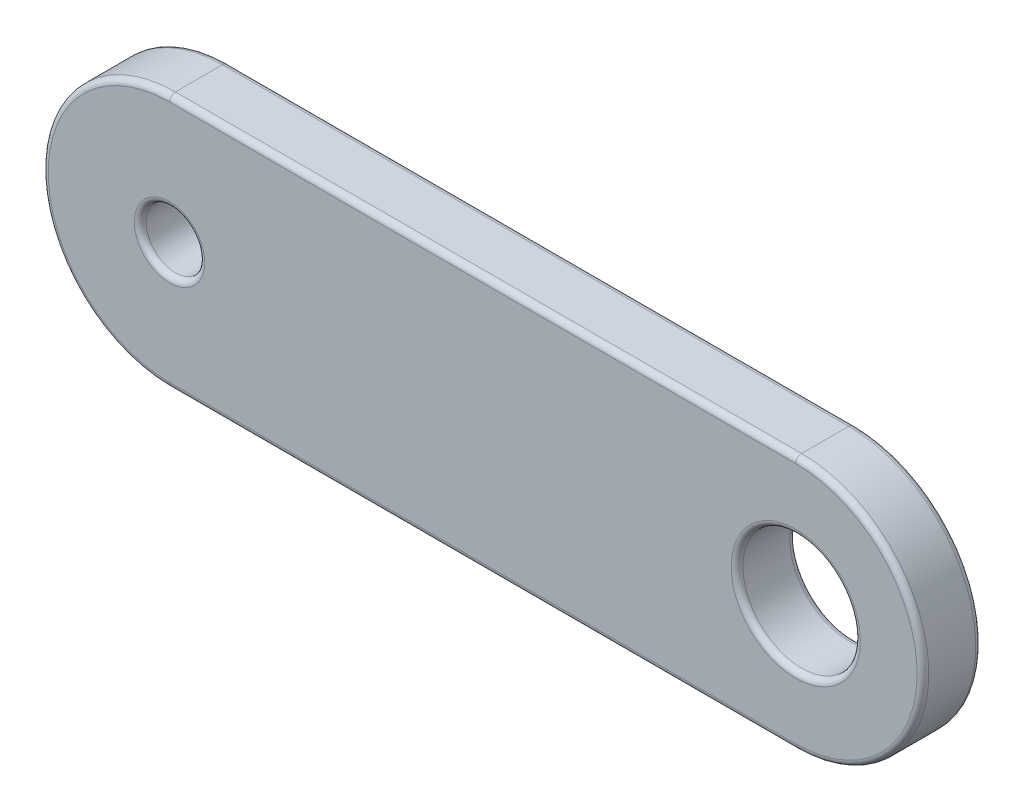
ISO-10303-21;
HEADER;
FILE_DESCRIPTION(('STEP AP214'),'2;1');
FILE_NAME('part.step','',(''),(''),'','','');
FILE_SCHEMA(('AUTOMOTIVE_DESIGN { 1 0 10303 214 1 1 1 1 }'));
ENDSEC;
DATA;
#1=APPLICATION_CONTEXT('core data for automotive mechanical design processes');
#2=APPLICATION_PROTOCOL_DEFINITION('international standard','automotive_design',2000,#1);
#3=PRODUCT_CONTEXT('',#1,'mechanical');
#4=PRODUCT('Part','Part','',(#3));
#5=PRODUCT_RELATED_PRODUCT_CATEGORY('part','',(#4));
#6=PRODUCT_DEFINITION_FORMATION('','',#4);
#7=PRODUCT_DEFINITION_CONTEXT('part definition',#1,'design');
#8=PRODUCT_DEFINITION('design','',#6,#7);
#9=PRODUCT_DEFINITION_SHAPE('','',#8);
#10=(LENGTH_UNIT() NAMED_UNIT(*) SI_UNIT(.MILLI.,.METRE.));
#11=(NAMED_UNIT(*) PLANE_ANGLE_UNIT() SI_UNIT($,.RADIAN.));
#12=(NAMED_UNIT(*) SI_UNIT($,.STERADIAN.) SOLID_ANGLE_UNIT());
#13=UNCERTAINTY_MEASURE_WITH_UNIT(LENGTH_MEASURE(1.E-05),#10,'distance_accuracy_value','');
#14=(GEOMETRIC_REPRESENTATION_CONTEXT(3) GLOBAL_UNCERTAINTY_ASSIGNED_CONTEXT((#13)) GLOBAL_UNIT_ASSIGNED_CONTEXT((#10,
#11,#12)) REPRESENTATION_CONTEXT('',''));
#15=CARTESIAN_POINT('',(0.,0.,0.));
#16=DIRECTION('',(0.,0.,1.));
#17=DIRECTION('',(1.,0.,0.));
#18=AXIS2_PLACEMENT_3D('',#15,#16,#17);
#19=CARTESIAN_POINT('',(-8.,0.,0.75));
#20=DIRECTION('',(0.,0.,1.));
#21=DIRECTION('',(1.,0.,0.));
#22=AXIS2_PLACEMENT_3D('',#19,#20,#21);
#23=PLANE('',#22);
#24=CARTESIAN_POINT('',(8.,0.,0.75));
#25=DIRECTION('',(0.,0.,1.));
#26=DIRECTION('',(1.,0.,0.));
#27=AXIS2_PLACEMENT_3D('',#24,#25,#26);
#28=CIRCLE('',#27,1.65);
#29=CARTESIAN_POINT('',(9.65,0.,0.75));
#30=VERTEX_POINT('',#29);
#31=EDGE_CURVE('E11',#30,#30,#28,.F.);
#32=ORIENTED_EDGE('',*,*,#31,.T.);
#33=EDGE_LOOP('',(#32));
#34=FACE_BOUND('',#33,.T.);
#35=CARTESIAN_POINT('',(8.,0.,0.75));
#36=DIRECTION('',(0.,0.,1.));
#37=DIRECTION('',(1.,0.,0.));
#38=AXIS2_PLACEMENT_3D('',#35,#36,#37);
#39=CIRCLE('',#38,3.1);
#40=CARTESIAN_POINT('',(8.,-3.1,0.75));
#41=VERTEX_POINT('',#40);
#42=CARTESIAN_POINT('',(8.,3.1,0.75));
#43=VERTEX_POINT('',#42);
#44=EDGE_CURVE('E52',#41,#43,#39,.T.);
#45=ORIENTED_EDGE('',*,*,#44,.T.);
#46=DIRECTION('',(-1.,0.,0.));
#47=VECTOR('',#46,1.);
#48=CARTESIAN_POINT('',(-8.,3.1,0.75));
#49=LINE('',#48,#47);
#50=CARTESIAN_POINT('',(-8.,3.1,0.75));
#51=VERTEX_POINT('',#50);
#52=EDGE_CURVE('E44',#43,#51,#49,.T.);
#53=ORIENTED_EDGE('',*,*,#52,.T.);
#54=CARTESIAN_POINT('',(-8.,0.,0.75));
#55=DIRECTION('',(0.,0.,1.));
#56=DIRECTION('',(1.,0.,0.));
#57=AXIS2_PLACEMENT_3D('',#54,#55,#56);
#58=CIRCLE('',#57,3.1);
#59=CARTESIAN_POINT('',(-8.,-3.1,0.75));
#60=VERTEX_POINT('',#59);
#61=EDGE_CURVE('E170',#51,#60,#58,.T.);
#62=ORIENTED_EDGE('',*,*,#61,.T.);
#63=DIRECTION('',(1.,0.,0.));
#64=VECTOR('',#63,1.);
#65=CARTESIAN_POINT('',(8.,-3.1,0.75));
#66=LINE('',#65,#64);
#67=EDGE_CURVE('E57',#60,#41,#66,.T.);
#68=ORIENTED_EDGE('',*,*,#67,.T.);
#69=EDGE_LOOP('',(#45,#53,#62,#68));
#70=FACE_BOUND('',#69,.T.);
#71=CARTESIAN_POINT('',(-8.,0.,0.75));
#72=DIRECTION('',(0.,0.,1.));
#73=DIRECTION('',(1.,0.,0.));
#74=AXIS2_PLACEMENT_3D('',#71,#72,#73);
#75=CIRCLE('',#74,0.9);
#76=CARTESIAN_POINT('',(-7.1,0.,0.75));
#77=VERTEX_POINT('',#76);
#78=EDGE_CURVE('E167',#77,#77,#75,.F.);
#79=ORIENTED_EDGE('',*,*,#78,.T.);
#80=EDGE_LOOP('',(#79));
#81=FACE_BOUND('',#80,.T.);
#82=ADVANCED_FACE('F35',(#34,#70,#81),#23,.T.);
#83=CARTESIAN_POINT('',(-8.,0.,-0.75));
#84=DIRECTION('',(0.,0.,1.));
#85=DIRECTION('',(1.,0.,0.));
#86=AXIS2_PLACEMENT_3D('',#83,#84,#85);
#87=PLANE('',#86);
#88=CARTESIAN_POINT('',(8.,0.,-0.75));
#89=DIRECTION('',(0.,0.,1.));
#90=DIRECTION('',(1.,0.,0.));
#91=AXIS2_PLACEMENT_3D('',#88,#89,#90);
#92=CIRCLE('',#91,1.65);
#93=CARTESIAN_POINT('',(9.65,0.,-0.75));
#94=VERTEX_POINT('',#93);
#95=EDGE_CURVE('E132',#94,#94,#92,.T.);
#96=ORIENTED_EDGE('',*,*,#95,.T.);
#97=EDGE_LOOP('',(#96));
#98=FACE_BOUND('',#97,.T.);
#99=CARTESIAN_POINT('',(-8.,0.,-0.75));
#100=DIRECTION('',(0.,0.,1.));
#101=DIRECTION('',(1.,0.,0.));
#102=AXIS2_PLACEMENT_3D('',#99,#100,#101);
#103=CIRCLE('',#102,0.9);
#104=CARTESIAN_POINT('',(-7.1,0.,-0.75));
#105=VERTEX_POINT('',#104);
#106=EDGE_CURVE('E129',#105,#105,#103,.T.);
#107=ORIENTED_EDGE('',*,*,#106,.T.);
#108=EDGE_LOOP('',(#107));
#109=FACE_BOUND('',#108,.T.);
#110=CARTESIAN_POINT('',(8.,0.,-0.75));
#111=DIRECTION('',(0.,0.,1.));
#112=DIRECTION('',(1.,0.,0.));
#113=AXIS2_PLACEMENT_3D('',#110,#111,#112);
#114=CIRCLE('',#113,3.1);
#115=CARTESIAN_POINT('',(8.,3.1,-0.75));
#116=VERTEX_POINT('',#115);
#117=CARTESIAN_POINT('',(8.,-3.1,-0.75));
#118=VERTEX_POINT('',#117);
#119=EDGE_CURVE('E128',#116,#118,#114,.F.);
#120=ORIENTED_EDGE('',*,*,#119,.T.);
#121=DIRECTION('',(1.,0.,0.));
#122=VECTOR('',#121,1.);
#123=CARTESIAN_POINT('',(-8.,-3.1,-0.75));
#124=LINE('',#123,#122);
#125=CARTESIAN_POINT('',(-8.,-3.1,-0.75));
#126=VERTEX_POINT('',#125);
#127=EDGE_CURVE('E107',#118,#126,#124,.F.);
#128=ORIENTED_EDGE('',*,*,#127,.T.);
#129=CARTESIAN_POINT('',(-8.,0.,-0.75));
#130=DIRECTION('',(0.,0.,1.));
#131=DIRECTION('',(1.,0.,0.));
#132=AXIS2_PLACEMENT_3D('',#129,#130,#131);
#133=CIRCLE('',#132,3.1);
#134=CARTESIAN_POINT('',(-8.,3.1,-0.75));
#135=VERTEX_POINT('',#134);
#136=EDGE_CURVE('E117',#126,#135,#133,.F.);
#137=ORIENTED_EDGE('',*,*,#136,.T.);
#138=DIRECTION('',(-1.,0.,0.));
#139=VECTOR('',#138,1.);
#140=CARTESIAN_POINT('',(-8.,3.1,-0.75));
#141=LINE('',#140,#139);
#142=EDGE_CURVE('E123',#135,#116,#141,.F.);
#143=ORIENTED_EDGE('',*,*,#142,.T.);
#144=EDGE_LOOP('',(#120,#128,#137,#143));
#145=FACE_BOUND('',#144,.T.);
#146=ADVANCED_FACE('F126',(#98,#109,#145),#87,.F.);
#147=CARTESIAN_POINT('',(-8.,0.,0.75));
#148=DIRECTION('',(0.,0.,-1.));
#149=DIRECTION('',(-1.,0.,0.));
#150=AXIS2_PLACEMENT_3D('',#147,#148,#149);
#151=CYLINDRICAL_SURFACE('',#150,3.25);
#152=DIRECTION('',(0.,0.,-1.));
#153=VECTOR('',#152,1.);
#154=CARTESIAN_POINT('',(-8.,3.25,0.75));
#155=LINE('',#154,#153);
#156=CARTESIAN_POINT('',(-8.,3.25,0.6));
#157=VERTEX_POINT('',#156);
#158=CARTESIAN_POINT('',(-8.,3.25,-0.6));
#159=VERTEX_POINT('',#158);
#160=EDGE_CURVE('E179',#157,#159,#155,.T.);
#161=ORIENTED_EDGE('',*,*,#160,.T.);
#162=CARTESIAN_POINT('',(-8.,0.,-0.6));
#163=DIRECTION('',(0.,0.,1.));
#164=DIRECTION('',(1.,0.,0.));
#165=AXIS2_PLACEMENT_3D('',#162,#163,#164);
#166=CIRCLE('',#165,3.25);
#167=CARTESIAN_POINT('',(-8.,-3.25,-0.6));
#168=VERTEX_POINT('',#167);
#169=EDGE_CURVE('E165',#159,#168,#166,.T.);
#170=ORIENTED_EDGE('',*,*,#169,.T.);
#171=DIRECTION('',(0.,0.,-1.));
#172=VECTOR('',#171,1.);
#173=CARTESIAN_POINT('',(-8.,-3.25,0.75));
#174=LINE('',#173,#172);
#175=CARTESIAN_POINT('',(-8.,-3.25,0.6));
#176=VERTEX_POINT('',#175);
#177=EDGE_CURVE('E124',#176,#168,#174,.T.);
#178=ORIENTED_EDGE('',*,*,#177,.F.);
#179=CARTESIAN_POINT('',(-8.,0.,0.6));
#180=DIRECTION('',(0.,0.,1.));
#181=DIRECTION('',(1.,0.,0.));
#182=AXIS2_PLACEMENT_3D('',#179,#180,#181);
#183=CIRCLE('',#182,3.25);
#184=EDGE_CURVE('E163',#176,#157,#183,.F.);
#185=ORIENTED_EDGE('',*,*,#184,.T.);
#186=EDGE_LOOP('',(#161,#170,#178,#185));
#187=FACE_BOUND('',#186,.T.);
#188=ADVANCED_FACE('F205',(#187),#151,.T.);
#189=CARTESIAN_POINT('',(-8.,-3.25,0.75));
#190=DIRECTION('',(0.,1.,0.));
#191=DIRECTION('',(0.,0.,1.));
#192=AXIS2_PLACEMENT_3D('',#189,#190,#191);
#193=PLANE('',#192);
#194=ORIENTED_EDGE('',*,*,#177,.T.);
#195=DIRECTION('',(1.,0.,0.));
#196=VECTOR('',#195,1.);
#197=CARTESIAN_POINT('',(-8.,-3.25,-0.6));
#198=LINE('',#197,#196);
#199=CARTESIAN_POINT('',(8.,-3.25,-0.6));
#200=VERTEX_POINT('',#199);
#201=EDGE_CURVE('E110',#168,#200,#198,.T.);
#202=ORIENTED_EDGE('',*,*,#201,.T.);
#203=DIRECTION('',(0.,0.,-1.));
#204=VECTOR('',#203,1.);
#205=CARTESIAN_POINT('',(8.,-3.25,0.75));
#206=LINE('',#205,#204);
#207=CARTESIAN_POINT('',(8.,-3.25,0.6));
#208=VERTEX_POINT('',#207);
#209=EDGE_CURVE('E202',#208,#200,#206,.T.);
#210=ORIENTED_EDGE('',*,*,#209,.F.);
#211=DIRECTION('',(1.,0.,0.));
#212=VECTOR('',#211,1.);
#213=CARTESIAN_POINT('',(-8.,-3.25,0.6));
#214=LINE('',#213,#212);
#215=EDGE_CURVE('E151',#208,#176,#214,.F.);
#216=ORIENTED_EDGE('',*,*,#215,.T.);
#217=EDGE_LOOP('',(#194,#202,#210,#216));
#218=FACE_BOUND('',#217,.T.);
#219=ADVANCED_FACE('F200',(#218),#193,.F.);
#220=CARTESIAN_POINT('',(8.,0.,0.75));
#221=DIRECTION('',(0.,0.,-1.));
#222=DIRECTION('',(-1.,0.,0.));
#223=AXIS2_PLACEMENT_3D('',#220,#221,#222);
#224=CYLINDRICAL_SURFACE('',#223,3.25);
#225=ORIENTED_EDGE('',*,*,#209,.T.);
#226=CARTESIAN_POINT('',(8.,0.,-0.6));
#227=DIRECTION('',(0.,0.,1.));
#228=DIRECTION('',(1.,0.,0.));
#229=AXIS2_PLACEMENT_3D('',#226,#227,#228);
#230=CIRCLE('',#229,3.25);
#231=CARTESIAN_POINT('',(8.,3.25,-0.6));
#232=VERTEX_POINT('',#231);
#233=EDGE_CURVE('E156',#200,#232,#230,.T.);
#234=ORIENTED_EDGE('',*,*,#233,.T.);
#235=DIRECTION('',(0.,0.,-1.));
#236=VECTOR('',#235,1.);
#237=CARTESIAN_POINT('',(8.,3.25,0.75));
#238=LINE('',#237,#236);
#239=CARTESIAN_POINT('',(8.,3.25,0.6));
#240=VERTEX_POINT('',#239);
#241=EDGE_CURVE('E208',#240,#232,#238,.T.);
#242=ORIENTED_EDGE('',*,*,#241,.F.);
#243=CARTESIAN_POINT('',(8.,0.,0.6));
#244=DIRECTION('',(0.,0.,1.));
#245=DIRECTION('',(1.,0.,0.));
#246=AXIS2_PLACEMENT_3D('',#243,#244,#245);
#247=CIRCLE('',#246,3.25);
#248=EDGE_CURVE('E154',#240,#208,#247,.F.);
#249=ORIENTED_EDGE('',*,*,#248,.T.);
#250=EDGE_LOOP('',(#225,#234,#242,#249));
#251=FACE_BOUND('',#250,.T.);
#252=ADVANCED_FACE('F221',(#251),#224,.T.);
#253=CARTESIAN_POINT('',(-8.,3.25,0.75));
#254=DIRECTION('',(0.,-1.,0.));
#255=DIRECTION('',(1.,0.,0.));
#256=AXIS2_PLACEMENT_3D('',#253,#254,#255);
#257=PLANE('',#256);
#258=ORIENTED_EDGE('',*,*,#241,.T.);
#259=DIRECTION('',(-1.,0.,0.));
#260=VECTOR('',#259,1.);
#261=CARTESIAN_POINT('',(-8.,3.25,-0.6));
#262=LINE('',#261,#260);
#263=EDGE_CURVE('E161',#232,#159,#262,.T.);
#264=ORIENTED_EDGE('',*,*,#263,.T.);
#265=ORIENTED_EDGE('',*,*,#160,.F.);
#266=DIRECTION('',(-1.,0.,0.));
#267=VECTOR('',#266,1.);
#268=CARTESIAN_POINT('',(8.,3.25,0.6));
#269=LINE('',#268,#267);
#270=EDGE_CURVE('E158',#157,#240,#269,.F.);
#271=ORIENTED_EDGE('',*,*,#270,.T.);
#272=EDGE_LOOP('',(#258,#264,#265,#271));
#273=FACE_BOUND('',#272,.T.);
#274=ADVANCED_FACE('F225',(#273),#257,.F.);
#275=CARTESIAN_POINT('',(-8.,0.,0.75));
#276=DIRECTION('',(0.,0.,-1.));
#277=DIRECTION('',(-1.,0.,0.));
#278=AXIS2_PLACEMENT_3D('',#275,#276,#277);
#279=CYLINDRICAL_SURFACE('',#278,0.75);
#280=CARTESIAN_POINT('',(-8.,0.,-0.6));
#281=DIRECTION('',(0.,0.,1.));
#282=DIRECTION('',(1.,0.,0.));
#283=AXIS2_PLACEMENT_3D('',#280,#281,#282);
#284=CIRCLE('',#283,0.75);
#285=CARTESIAN_POINT('',(-7.25,0.,-0.6));
#286=VERTEX_POINT('',#285);
#287=EDGE_CURVE('E148',#286,#286,#284,.F.);
#288=ORIENTED_EDGE('',*,*,#287,.T.);
#289=EDGE_LOOP('',(#288));
#290=FACE_BOUND('',#289,.T.);
#291=CARTESIAN_POINT('',(-8.,0.,0.6));
#292=DIRECTION('',(0.,0.,1.));
#293=DIRECTION('',(1.,0.,0.));
#294=AXIS2_PLACEMENT_3D('',#291,#292,#293);
#295=CIRCLE('',#294,0.75);
#296=CARTESIAN_POINT('',(-7.25,0.,0.6));
#297=VERTEX_POINT('',#296);
#298=EDGE_CURVE('E145',#297,#297,#295,.T.);
#299=ORIENTED_EDGE('',*,*,#298,.T.);
#300=EDGE_LOOP('',(#299));
#301=FACE_BOUND('',#300,.T.);
#302=ADVANCED_FACE('F241',(#290,#301),#279,.F.);
#303=CARTESIAN_POINT('',(8.,0.,0.75));
#304=DIRECTION('',(0.,0.,-1.));
#305=DIRECTION('',(-1.,0.,0.));
#306=AXIS2_PLACEMENT_3D('',#303,#304,#305);
#307=CYLINDRICAL_SURFACE('',#306,1.5);
#308=CARTESIAN_POINT('',(8.,0.,-0.6));
#309=DIRECTION('',(0.,0.,1.));
#310=DIRECTION('',(1.,0.,0.));
#311=AXIS2_PLACEMENT_3D('',#308,#309,#310);
#312=CIRCLE('',#311,1.5);
#313=CARTESIAN_POINT('',(9.5,0.,-0.6));
#314=VERTEX_POINT('',#313);
#315=EDGE_CURVE('E142',#314,#314,#312,.F.);
#316=ORIENTED_EDGE('',*,*,#315,.T.);
#317=EDGE_LOOP('',(#316));
#318=FACE_BOUND('',#317,.T.);
#319=CARTESIAN_POINT('',(8.,0.,0.6));
#320=DIRECTION('',(0.,0.,1.));
#321=DIRECTION('',(1.,0.,0.));
#322=AXIS2_PLACEMENT_3D('',#319,#320,#321);
#323=CIRCLE('',#322,1.5);
#324=CARTESIAN_POINT('',(9.5,0.,0.6));
#325=VERTEX_POINT('',#324);
#326=EDGE_CURVE('E139',#325,#325,#323,.T.);
#327=ORIENTED_EDGE('',*,*,#326,.T.);
#328=EDGE_LOOP('',(#327));
#329=FACE_BOUND('',#328,.T.);
#330=ADVANCED_FACE('F243',(#318,#329),#307,.F.);
#331=CARTESIAN_POINT('',(8.,0.,-0.6));
#332=DIRECTION('',(0.,0.,1.));
#333=DIRECTION('',(1.,0.,0.));
#334=AXIS2_PLACEMENT_3D('',#331,#332,#333);
#335=TOROIDAL_SURFACE('',#334,1.65,0.15);
#336=ORIENTED_EDGE('',*,*,#315,.F.);
#337=EDGE_LOOP('',(#336));
#338=FACE_BOUND('',#337,.T.);
#339=ORIENTED_EDGE('',*,*,#95,.F.);
#340=EDGE_LOOP('',(#339));
#341=FACE_BOUND('',#340,.T.);
#342=ADVANCED_FACE('F250',(#338,#341),#335,.T.);
#343=CARTESIAN_POINT('',(-8.,0.,-0.6));
#344=DIRECTION('',(0.,0.,1.));
#345=DIRECTION('',(1.,0.,0.));
#346=AXIS2_PLACEMENT_3D('',#343,#344,#345);
#347=TOROIDAL_SURFACE('',#346,0.9,0.15);
#348=ORIENTED_EDGE('',*,*,#287,.F.);
#349=EDGE_LOOP('',(#348));
#350=FACE_BOUND('',#349,.T.);
#351=ORIENTED_EDGE('',*,*,#106,.F.);
#352=EDGE_LOOP('',(#351));
#353=FACE_BOUND('',#352,.T.);
#354=ADVANCED_FACE('F266',(#350,#353),#347,.T.);
#355=CARTESIAN_POINT('',(-8.,3.1,-0.6));
#356=DIRECTION('',(-1.,0.,0.));
#357=DIRECTION('',(0.,-1.,0.));
#358=AXIS2_PLACEMENT_3D('',#355,#356,#357);
#359=CYLINDRICAL_SURFACE('',#358,0.15);
#360=CARTESIAN_POINT('',(8.,3.1,-0.6));
#361=DIRECTION('',(1.,0.,0.));
#362=DIRECTION('',(0.,0.,-1.));
#363=AXIS2_PLACEMENT_3D('',#360,#361,#362);
#364=CIRCLE('',#363,0.15);
#365=EDGE_CURVE('E113',#116,#232,#364,.T.);
#366=ORIENTED_EDGE('',*,*,#365,.F.);
#367=ORIENTED_EDGE('',*,*,#142,.F.);
#368=CARTESIAN_POINT('',(-8.,3.1,-0.6));
#369=DIRECTION('',(-1.,0.,0.));
#370=DIRECTION('',(0.,0.,1.));
#371=AXIS2_PLACEMENT_3D('',#368,#369,#370);
#372=CIRCLE('',#371,0.15);
#373=EDGE_CURVE('E120',#159,#135,#372,.T.);
#374=ORIENTED_EDGE('',*,*,#373,.F.);
#375=ORIENTED_EDGE('',*,*,#263,.F.);
#376=EDGE_LOOP('',(#366,#367,#374,#375));
#377=FACE_BOUND('',#376,.T.);
#378=ADVANCED_FACE('F214',(#377),#359,.T.);
#379=CARTESIAN_POINT('',(-8.,0.,-0.6));
#380=DIRECTION('',(0.,0.,1.));
#381=DIRECTION('',(1.,0.,0.));
#382=AXIS2_PLACEMENT_3D('',#379,#380,#381);
#383=TOROIDAL_SURFACE('',#382,3.1,0.15);
#384=ORIENTED_EDGE('',*,*,#373,.T.);
#385=ORIENTED_EDGE('',*,*,#136,.F.);
#386=CARTESIAN_POINT('',(-8.,-3.1,-0.6));
#387=DIRECTION('',(1.,0.,0.));
#388=DIRECTION('',(0.,0.,-1.));
#389=AXIS2_PLACEMENT_3D('',#386,#387,#388);
#390=CIRCLE('',#389,0.15);
#391=EDGE_CURVE('E103',#168,#126,#390,.T.);
#392=ORIENTED_EDGE('',*,*,#391,.F.);
#393=ORIENTED_EDGE('',*,*,#169,.F.);
#394=EDGE_LOOP('',(#384,#385,#392,#393));
#395=FACE_BOUND('',#394,.T.);
#396=ADVANCED_FACE('F118',(#395),#383,.T.);
#397=CARTESIAN_POINT('',(8.,0.,-0.6));
#398=DIRECTION('',(0.,0.,1.));
#399=DIRECTION('',(1.,0.,0.));
#400=AXIS2_PLACEMENT_3D('',#397,#398,#399);
#401=TOROIDAL_SURFACE('',#400,3.1,0.15);
#402=ORIENTED_EDGE('',*,*,#365,.T.);
#403=ORIENTED_EDGE('',*,*,#233,.F.);
#404=CARTESIAN_POINT('',(8.,-3.1,-0.6));
#405=DIRECTION('',(-1.,0.,0.));
#406=DIRECTION('',(0.,0.,1.));
#407=AXIS2_PLACEMENT_3D('',#404,#405,#406);
#408=CIRCLE('',#407,0.15);
#409=EDGE_CURVE('E114',#118,#200,#408,.T.);
#410=ORIENTED_EDGE('',*,*,#409,.F.);
#411=ORIENTED_EDGE('',*,*,#119,.F.);
#412=EDGE_LOOP('',(#402,#403,#410,#411));
#413=FACE_BOUND('',#412,.T.);
#414=ADVANCED_FACE('F217',(#413),#401,.T.);
#415=CARTESIAN_POINT('',(-8.,-3.1,-0.6));
#416=DIRECTION('',(1.,0.,0.));
#417=DIRECTION('',(0.,0.,-1.));
#418=AXIS2_PLACEMENT_3D('',#415,#416,#417);
#419=CYLINDRICAL_SURFACE('',#418,0.15);
#420=ORIENTED_EDGE('',*,*,#391,.T.);
#421=ORIENTED_EDGE('',*,*,#127,.F.);
#422=ORIENTED_EDGE('',*,*,#409,.T.);
#423=ORIENTED_EDGE('',*,*,#201,.F.);
#424=EDGE_LOOP('',(#420,#421,#422,#423));
#425=FACE_BOUND('',#424,.T.);
#426=ADVANCED_FACE('F105',(#425),#419,.T.);
#427=CARTESIAN_POINT('',(8.,0.,0.6));
#428=DIRECTION('',(0.,0.,1.));
#429=DIRECTION('',(1.,0.,0.));
#430=AXIS2_PLACEMENT_3D('',#427,#428,#429);
#431=TOROIDAL_SURFACE('',#430,1.65,0.15);
#432=ORIENTED_EDGE('',*,*,#31,.F.);
#433=EDGE_LOOP('',(#432));
#434=FACE_BOUND('',#433,.T.);
#435=ORIENTED_EDGE('',*,*,#326,.F.);
#436=EDGE_LOOP('',(#435));
#437=FACE_BOUND('',#436,.T.);
#438=ADVANCED_FACE('F273',(#434,#437),#431,.T.);
#439=CARTESIAN_POINT('',(-8.,-3.1,0.6));
#440=DIRECTION('',(-1.,0.,0.));
#441=DIRECTION('',(0.,0.,1.));
#442=AXIS2_PLACEMENT_3D('',#439,#440,#441);
#443=CYLINDRICAL_SURFACE('',#442,0.15);
#444=CARTESIAN_POINT('',(-8.,-3.1,0.6));
#445=DIRECTION('',(-1.,0.,0.));
#446=DIRECTION('',(0.,0.,1.));
#447=AXIS2_PLACEMENT_3D('',#444,#445,#446);
#448=CIRCLE('',#447,0.15);
#449=EDGE_CURVE('E183',#176,#60,#448,.T.);
#450=ORIENTED_EDGE('',*,*,#449,.F.);
#451=ORIENTED_EDGE('',*,*,#215,.F.);
#452=CARTESIAN_POINT('',(8.,-3.1,0.6));
#453=DIRECTION('',(1.,0.,0.));
#454=DIRECTION('',(0.,0.,-1.));
#455=AXIS2_PLACEMENT_3D('',#452,#453,#454);
#456=CIRCLE('',#455,0.15);
#457=EDGE_CURVE('E39',#41,#208,#456,.T.);
#458=ORIENTED_EDGE('',*,*,#457,.F.);
#459=ORIENTED_EDGE('',*,*,#67,.F.);
#460=EDGE_LOOP('',(#450,#451,#458,#459));
#461=FACE_BOUND('',#460,.T.);
#462=ADVANCED_FACE('F195',(#461),#443,.T.);
#463=CARTESIAN_POINT('',(8.,0.,0.6));
#464=DIRECTION('',(0.,0.,1.));
#465=DIRECTION('',(1.,0.,0.));
#466=AXIS2_PLACEMENT_3D('',#463,#464,#465);
#467=TOROIDAL_SURFACE('',#466,3.1,0.15);
#468=ORIENTED_EDGE('',*,*,#457,.T.);
#469=ORIENTED_EDGE('',*,*,#248,.F.);
#470=CARTESIAN_POINT('',(8.,3.1,0.6));
#471=DIRECTION('',(-1.,0.,0.));
#472=DIRECTION('',(0.,0.,1.));
#473=AXIS2_PLACEMENT_3D('',#470,#471,#472);
#474=CIRCLE('',#473,0.15);
#475=EDGE_CURVE('E182',#43,#240,#474,.T.);
#476=ORIENTED_EDGE('',*,*,#475,.F.);
#477=ORIENTED_EDGE('',*,*,#44,.F.);
#478=EDGE_LOOP('',(#468,#469,#476,#477));
#479=FACE_BOUND('',#478,.T.);
#480=ADVANCED_FACE('F192',(#479),#467,.T.);
#481=CARTESIAN_POINT('',(-8.,0.,0.6));
#482=DIRECTION('',(0.,0.,1.));
#483=DIRECTION('',(1.,0.,0.));
#484=AXIS2_PLACEMENT_3D('',#481,#482,#483);
#485=TOROIDAL_SURFACE('',#484,3.1,0.15);
#486=ORIENTED_EDGE('',*,*,#449,.T.);
#487=ORIENTED_EDGE('',*,*,#61,.F.);
#488=CARTESIAN_POINT('',(-8.,3.1,0.6));
#489=DIRECTION('',(1.,0.,0.));
#490=DIRECTION('',(0.,0.,-1.));
#491=AXIS2_PLACEMENT_3D('',#488,#489,#490);
#492=CIRCLE('',#491,0.15);
#493=EDGE_CURVE('E180',#157,#51,#492,.T.);
#494=ORIENTED_EDGE('',*,*,#493,.F.);
#495=ORIENTED_EDGE('',*,*,#184,.F.);
#496=EDGE_LOOP('',(#486,#487,#494,#495));
#497=FACE_BOUND('',#496,.T.);
#498=ADVANCED_FACE('F230',(#497),#485,.T.);
#499=CARTESIAN_POINT('',(-8.,3.1,0.6));
#500=DIRECTION('',(1.,0.,0.));
#501=DIRECTION('',(0.,1.,0.));
#502=AXIS2_PLACEMENT_3D('',#499,#500,#501);
#503=CYLINDRICAL_SURFACE('',#502,0.15);
#504=ORIENTED_EDGE('',*,*,#475,.T.);
#505=ORIENTED_EDGE('',*,*,#270,.F.);
#506=ORIENTED_EDGE('',*,*,#493,.T.);
#507=ORIENTED_EDGE('',*,*,#52,.F.);
#508=EDGE_LOOP('',(#504,#505,#506,#507));
#509=FACE_BOUND('',#508,.T.);
#510=ADVANCED_FACE('F228',(#509),#503,.T.);
#511=CARTESIAN_POINT('',(-8.,0.,0.6));
#512=DIRECTION('',(0.,0.,1.));
#513=DIRECTION('',(1.,0.,0.));
#514=AXIS2_PLACEMENT_3D('',#511,#512,#513);
#515=TOROIDAL_SURFACE('',#514,0.9,0.15);
#516=ORIENTED_EDGE('',*,*,#78,.F.);
#517=EDGE_LOOP('',(#516));
#518=FACE_BOUND('',#517,.T.);
#519=ORIENTED_EDGE('',*,*,#298,.F.);
#520=EDGE_LOOP('',(#519));
#521=FACE_BOUND('',#520,.T.);
#522=ADVANCED_FACE('F37',(#518,#521),#515,.T.);
#523=CLOSED_SHELL('',(#82,#146,#188,#219,#252,#274,#302,#330,#342,#354,#378,#396,#414,#426,#438,
#462,#480,#498,#510,#522));
#524=MANIFOLD_SOLID_BREP('B2',#523);
#525=ADVANCED_BREP_SHAPE_REPRESENTATION('',(#18,#524),#14);
#526=SHAPE_DEFINITION_REPRESENTATION(#9,#525);
ENDSEC;
END-ISO-10303-21;
